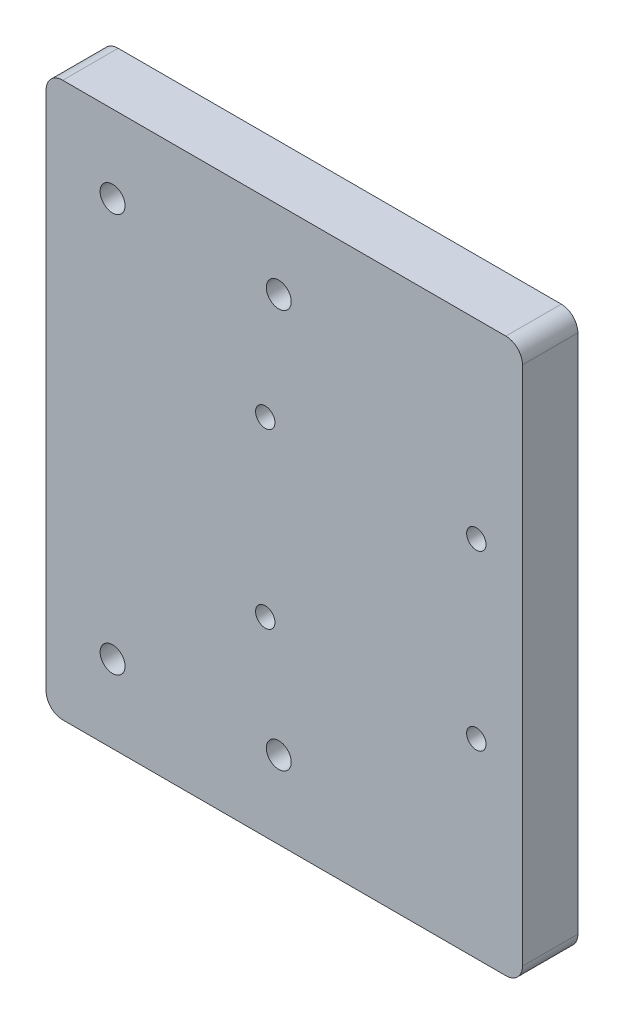
ISO-10303-21;
HEADER;
FILE_DESCRIPTION(('STEP AP214'),'2;1');
FILE_NAME('part.step','',(''),(''),'','','');
FILE_SCHEMA(('AUTOMOTIVE_DESIGN { 1 0 10303 214 1 1 1 1 }'));
ENDSEC;
DATA;
#1=APPLICATION_CONTEXT('core data for automotive mechanical design processes');
#2=APPLICATION_PROTOCOL_DEFINITION('international standard','automotive_design',2000,#1);
#3=PRODUCT_CONTEXT('',#1,'mechanical');
#4=PRODUCT('Part','Part','',(#3));
#5=PRODUCT_RELATED_PRODUCT_CATEGORY('part','',(#4));
#6=PRODUCT_DEFINITION_FORMATION('','',#4);
#7=PRODUCT_DEFINITION_CONTEXT('part definition',#1,'design');
#8=PRODUCT_DEFINITION('design','',#6,#7);
#9=PRODUCT_DEFINITION_SHAPE('','',#8);
#10=(LENGTH_UNIT() NAMED_UNIT(*) SI_UNIT(.MILLI.,.METRE.));
#11=(NAMED_UNIT(*) PLANE_ANGLE_UNIT() SI_UNIT($,.RADIAN.));
#12=(NAMED_UNIT(*) SI_UNIT($,.STERADIAN.) SOLID_ANGLE_UNIT());
#13=UNCERTAINTY_MEASURE_WITH_UNIT(LENGTH_MEASURE(1.E-05),#10,'distance_accuracy_value','');
#14=(GEOMETRIC_REPRESENTATION_CONTEXT(3) GLOBAL_UNCERTAINTY_ASSIGNED_CONTEXT((#13)) GLOBAL_UNIT_ASSIGNED_CONTEXT((#10,
#11,#12)) REPRESENTATION_CONTEXT('',''));
#15=CARTESIAN_POINT('',(0.,0.,0.));
#16=DIRECTION('',(0.,0.,1.));
#17=DIRECTION('',(1.,0.,0.));
#18=AXIS2_PLACEMENT_3D('',#15,#16,#17);
#19=CARTESIAN_POINT('',(-40.,-47.,10.));
#20=DIRECTION('',(0.,0.,-1.));
#21=DIRECTION('',(-1.,0.,0.));
#22=AXIS2_PLACEMENT_3D('',#19,#20,#21);
#23=PLANE('',#22);
#24=CARTESIAN_POINT('',(-40.,-47.,10.));
#25=DIRECTION('',(0.,0.,1.));
#26=DIRECTION('',(-1.,0.,0.));
#27=AXIS2_PLACEMENT_3D('',#24,#25,#26);
#28=CIRCLE('',#27,2.99999999999691);
#29=CARTESIAN_POINT('',(-42.9999999999969,-47.,10.));
#30=VERTEX_POINT('',#29);
#31=CARTESIAN_POINT('',(-40.,-49.9999999999969,10.));
#32=VERTEX_POINT('',#31);
#33=EDGE_CURVE('E155',#30,#32,#28,.T.);
#34=ORIENTED_EDGE('',*,*,#33,.T.);
#35=DIRECTION('',(1.,0.,0.));
#36=VECTOR('',#35,1.);
#37=CARTESIAN_POINT('',(39.9999999850309,-49.9999999999969,10.));
#38=LINE('',#37,#36);
#39=CARTESIAN_POINT('',(39.9999999850309,-49.9999999999969,10.));
#40=VERTEX_POINT('',#39);
#41=EDGE_CURVE('E103',#32,#40,#38,.T.);
#42=ORIENTED_EDGE('',*,*,#41,.T.);
#43=CARTESIAN_POINT('',(39.9999999850309,-46.9999999999969,10.));
#44=DIRECTION('',(0.,0.,1.));
#45=DIRECTION('',(-1.,0.,0.));
#46=AXIS2_PLACEMENT_3D('',#43,#44,#45);
#47=CIRCLE('',#46,3.00000000000002);
#48=CARTESIAN_POINT('',(42.9999999850309,-46.9999999999969,10.));
#49=VERTEX_POINT('',#48);
#50=EDGE_CURVE('E170',#40,#49,#47,.T.);
#51=ORIENTED_EDGE('',*,*,#50,.T.);
#52=DIRECTION('',(0.,1.,0.));
#53=VECTOR('',#52,1.);
#54=CARTESIAN_POINT('',(42.9999999850309,47.0000000000031,10.));
#55=LINE('',#54,#53);
#56=CARTESIAN_POINT('',(42.9999999850309,47.0000000000031,10.));
#57=VERTEX_POINT('',#56);
#58=EDGE_CURVE('E183',#49,#57,#55,.T.);
#59=ORIENTED_EDGE('',*,*,#58,.T.);
#60=CARTESIAN_POINT('',(39.9999999850309,46.9999999999969,10.));
#61=DIRECTION('',(0.,0.,1.));
#62=DIRECTION('',(-1.,0.,0.));
#63=AXIS2_PLACEMENT_3D('',#60,#61,#62);
#64=CIRCLE('',#63,3.);
#65=CARTESIAN_POINT('',(39.9999999850309,49.9999999999969,10.));
#66=VERTEX_POINT('',#65);
#67=EDGE_CURVE('E122',#57,#66,#64,.T.);
#68=ORIENTED_EDGE('',*,*,#67,.T.);
#69=DIRECTION('',(-1.,0.,0.));
#70=VECTOR('',#69,1.);
#71=CARTESIAN_POINT('',(-40.,49.9999999999969,10.));
#72=LINE('',#71,#70);
#73=CARTESIAN_POINT('',(-40.,49.9999999999969,10.));
#74=VERTEX_POINT('',#73);
#75=EDGE_CURVE('E116',#66,#74,#72,.T.);
#76=ORIENTED_EDGE('',*,*,#75,.T.);
#77=CARTESIAN_POINT('',(-40.,47.,10.));
#78=DIRECTION('',(0.,0.,1.));
#79=DIRECTION('',(-1.,0.,0.));
#80=AXIS2_PLACEMENT_3D('',#77,#78,#79);
#81=CIRCLE('',#80,2.99999999999691);
#82=CARTESIAN_POINT('',(-42.9999999999969,47.,10.));
#83=VERTEX_POINT('',#82);
#84=EDGE_CURVE('E120',#74,#83,#81,.T.);
#85=ORIENTED_EDGE('',*,*,#84,.T.);
#86=DIRECTION('',(0.,-1.,0.));
#87=VECTOR('',#86,1.);
#88=CARTESIAN_POINT('',(-42.9999999999969,-47.,10.));
#89=LINE('',#88,#87);
#90=EDGE_CURVE('E60',#83,#30,#89,.T.);
#91=ORIENTED_EDGE('',*,*,#90,.T.);
#92=EDGE_LOOP('',(#34,#42,#51,#59,#68,#76,#85,#91));
#93=FACE_BOUND('',#92,.T.);
#94=CARTESIAN_POINT('',(-31.,-36.,10.));
#95=DIRECTION('',(0.,0.,1.));
#96=DIRECTION('',(1.,0.,0.));
#97=AXIS2_PLACEMENT_3D('',#94,#95,#96);
#98=CIRCLE('',#97,2.25);
#99=CARTESIAN_POINT('',(-28.75,-36.,10.));
#100=VERTEX_POINT('',#99);
#101=EDGE_CURVE('E144',#100,#100,#98,.T.);
#102=ORIENTED_EDGE('',*,*,#101,.F.);
#103=EDGE_LOOP('',(#102));
#104=FACE_BOUND('',#103,.T.);
#105=CARTESIAN_POINT('',(-1.,-36.,10.));
#106=DIRECTION('',(0.,0.,1.));
#107=DIRECTION('',(1.,0.,0.));
#108=AXIS2_PLACEMENT_3D('',#105,#106,#107);
#109=CIRCLE('',#108,2.25);
#110=CARTESIAN_POINT('',(1.25,-36.,10.));
#111=VERTEX_POINT('',#110);
#112=EDGE_CURVE('E192',#111,#111,#109,.T.);
#113=ORIENTED_EDGE('',*,*,#112,.F.);
#114=EDGE_LOOP('',(#113));
#115=FACE_BOUND('',#114,.T.);
#116=CARTESIAN_POINT('',(-3.4375,-15.621,10.));
#117=DIRECTION('',(0.,0.,1.));
#118=DIRECTION('',(1.,0.,0.));
#119=AXIS2_PLACEMENT_3D('',#116,#117,#118);
#120=CIRCLE('',#119,1.75);
#121=CARTESIAN_POINT('',(-1.6875,-15.621,10.));
#122=VERTEX_POINT('',#121);
#123=EDGE_CURVE('E198',#122,#122,#120,.T.);
#124=ORIENTED_EDGE('',*,*,#123,.F.);
#125=EDGE_LOOP('',(#124));
#126=FACE_BOUND('',#125,.T.);
#127=CARTESIAN_POINT('',(34.6625,-15.621,10.));
#128=DIRECTION('',(0.,0.,1.));
#129=DIRECTION('',(1.,0.,0.));
#130=AXIS2_PLACEMENT_3D('',#127,#128,#129);
#131=CIRCLE('',#130,1.75);
#132=CARTESIAN_POINT('',(36.4125,-15.621,10.));
#133=VERTEX_POINT('',#132);
#134=EDGE_CURVE('E204',#133,#133,#131,.T.);
#135=ORIENTED_EDGE('',*,*,#134,.F.);
#136=EDGE_LOOP('',(#135));
#137=FACE_BOUND('',#136,.T.);
#138=CARTESIAN_POINT('',(-3.4375,15.621,10.));
#139=DIRECTION('',(0.,0.,1.));
#140=DIRECTION('',(1.,0.,0.));
#141=AXIS2_PLACEMENT_3D('',#138,#139,#140);
#142=CIRCLE('',#141,1.75);
#143=CARTESIAN_POINT('',(-1.6875,15.621,10.));
#144=VERTEX_POINT('',#143);
#145=EDGE_CURVE('E210',#144,#144,#142,.T.);
#146=ORIENTED_EDGE('',*,*,#145,.F.);
#147=EDGE_LOOP('',(#146));
#148=FACE_BOUND('',#147,.T.);
#149=CARTESIAN_POINT('',(-31.,36.,10.));
#150=DIRECTION('',(0.,0.,1.));
#151=DIRECTION('',(1.,0.,0.));
#152=AXIS2_PLACEMENT_3D('',#149,#150,#151);
#153=CIRCLE('',#152,2.25);
#154=CARTESIAN_POINT('',(-28.75,36.,10.));
#155=VERTEX_POINT('',#154);
#156=EDGE_CURVE('E216',#155,#155,#153,.T.);
#157=ORIENTED_EDGE('',*,*,#156,.F.);
#158=EDGE_LOOP('',(#157));
#159=FACE_BOUND('',#158,.T.);
#160=CARTESIAN_POINT('',(-1.,36.,10.));
#161=DIRECTION('',(0.,0.,1.));
#162=DIRECTION('',(1.,0.,0.));
#163=AXIS2_PLACEMENT_3D('',#160,#161,#162);
#164=CIRCLE('',#163,2.25);
#165=CARTESIAN_POINT('',(1.25,36.,10.));
#166=VERTEX_POINT('',#165);
#167=EDGE_CURVE('E222',#166,#166,#164,.T.);
#168=ORIENTED_EDGE('',*,*,#167,.F.);
#169=EDGE_LOOP('',(#168));
#170=FACE_BOUND('',#169,.T.);
#171=CARTESIAN_POINT('',(34.6625,15.621,10.));
#172=DIRECTION('',(0.,0.,1.));
#173=DIRECTION('',(1.,0.,0.));
#174=AXIS2_PLACEMENT_3D('',#171,#172,#173);
#175=CIRCLE('',#174,1.75);
#176=CARTESIAN_POINT('',(36.4125,15.621,10.));
#177=VERTEX_POINT('',#176);
#178=EDGE_CURVE('E228',#177,#177,#175,.T.);
#179=ORIENTED_EDGE('',*,*,#178,.F.);
#180=EDGE_LOOP('',(#179));
#181=FACE_BOUND('',#180,.T.);
#182=ADVANCED_FACE('F43',(#93,#104,#115,#126,#137,#148,#159,#170,#181),#23,.F.);
#183=CARTESIAN_POINT('',(-40.,-47.,0.));
#184=DIRECTION('',(0.,0.,-1.));
#185=DIRECTION('',(-1.,0.,0.));
#186=AXIS2_PLACEMENT_3D('',#183,#184,#185);
#187=PLANE('',#186);
#188=CARTESIAN_POINT('',(-1.,36.,0.));
#189=DIRECTION('',(0.,0.,1.));
#190=DIRECTION('',(1.,0.,0.));
#191=AXIS2_PLACEMENT_3D('',#188,#189,#190);
#192=CIRCLE('',#191,2.25);
#193=CARTESIAN_POINT('',(1.25,36.,0.));
#194=VERTEX_POINT('',#193);
#195=EDGE_CURVE('E225',#194,#194,#192,.T.);
#196=ORIENTED_EDGE('',*,*,#195,.T.);
#197=EDGE_LOOP('',(#196));
#198=FACE_BOUND('',#197,.T.);
#199=CARTESIAN_POINT('',(-3.4375,15.621,0.));
#200=DIRECTION('',(0.,0.,1.));
#201=DIRECTION('',(1.,0.,0.));
#202=AXIS2_PLACEMENT_3D('',#199,#200,#201);
#203=CIRCLE('',#202,1.75);
#204=CARTESIAN_POINT('',(-1.6875,15.621,0.));
#205=VERTEX_POINT('',#204);
#206=EDGE_CURVE('E213',#205,#205,#203,.T.);
#207=ORIENTED_EDGE('',*,*,#206,.T.);
#208=EDGE_LOOP('',(#207));
#209=FACE_BOUND('',#208,.T.);
#210=CARTESIAN_POINT('',(-3.4375,-15.621,0.));
#211=DIRECTION('',(0.,0.,1.));
#212=DIRECTION('',(1.,0.,0.));
#213=AXIS2_PLACEMENT_3D('',#210,#211,#212);
#214=CIRCLE('',#213,1.75);
#215=CARTESIAN_POINT('',(-1.6875,-15.621,0.));
#216=VERTEX_POINT('',#215);
#217=EDGE_CURVE('E201',#216,#216,#214,.T.);
#218=ORIENTED_EDGE('',*,*,#217,.T.);
#219=EDGE_LOOP('',(#218));
#220=FACE_BOUND('',#219,.T.);
#221=CARTESIAN_POINT('',(-31.,-36.,0.));
#222=DIRECTION('',(0.,0.,1.));
#223=DIRECTION('',(1.,0.,0.));
#224=AXIS2_PLACEMENT_3D('',#221,#222,#223);
#225=CIRCLE('',#224,2.25);
#226=CARTESIAN_POINT('',(-28.75,-36.,0.));
#227=VERTEX_POINT('',#226);
#228=EDGE_CURVE('E189',#227,#227,#225,.T.);
#229=ORIENTED_EDGE('',*,*,#228,.T.);
#230=EDGE_LOOP('',(#229));
#231=FACE_BOUND('',#230,.T.);
#232=CARTESIAN_POINT('',(-40.,-47.,0.));
#233=DIRECTION('',(0.,0.,1.));
#234=DIRECTION('',(-1.,0.,0.));
#235=AXIS2_PLACEMENT_3D('',#232,#233,#234);
#236=CIRCLE('',#235,2.99999999999691);
#237=CARTESIAN_POINT('',(-42.9999999999969,-47.,0.));
#238=VERTEX_POINT('',#237);
#239=CARTESIAN_POINT('',(-40.,-49.9999999999969,0.));
#240=VERTEX_POINT('',#239);
#241=EDGE_CURVE('E140',#238,#240,#236,.T.);
#242=ORIENTED_EDGE('',*,*,#241,.F.);
#243=DIRECTION('',(0.,-1.,0.));
#244=VECTOR('',#243,1.);
#245=CARTESIAN_POINT('',(-42.9999999999969,-47.,0.));
#246=LINE('',#245,#244);
#247=CARTESIAN_POINT('',(-42.9999999999969,47.,0.));
#248=VERTEX_POINT('',#247);
#249=EDGE_CURVE('E95',#248,#238,#246,.T.);
#250=ORIENTED_EDGE('',*,*,#249,.F.);
#251=CARTESIAN_POINT('',(-40.,47.,0.));
#252=DIRECTION('',(0.,0.,1.));
#253=DIRECTION('',(-1.,0.,0.));
#254=AXIS2_PLACEMENT_3D('',#251,#252,#253);
#255=CIRCLE('',#254,2.99999999999691);
#256=CARTESIAN_POINT('',(-40.,49.9999999999969,0.));
#257=VERTEX_POINT('',#256);
#258=EDGE_CURVE('E89',#257,#248,#255,.T.);
#259=ORIENTED_EDGE('',*,*,#258,.F.);
#260=DIRECTION('',(-1.,0.,0.));
#261=VECTOR('',#260,1.);
#262=CARTESIAN_POINT('',(-40.,49.9999999999969,0.));
#263=LINE('',#262,#261);
#264=CARTESIAN_POINT('',(39.9999999850309,49.9999999999969,0.));
#265=VERTEX_POINT('',#264);
#266=EDGE_CURVE('E130',#265,#257,#263,.T.);
#267=ORIENTED_EDGE('',*,*,#266,.F.);
#268=CARTESIAN_POINT('',(39.9999999850309,46.9999999999969,0.));
#269=DIRECTION('',(0.,0.,1.));
#270=DIRECTION('',(-1.,0.,0.));
#271=AXIS2_PLACEMENT_3D('',#268,#269,#270);
#272=CIRCLE('',#271,3.);
#273=CARTESIAN_POINT('',(42.9999999850309,47.0000000000031,0.));
#274=VERTEX_POINT('',#273);
#275=EDGE_CURVE('E150',#274,#265,#272,.T.);
#276=ORIENTED_EDGE('',*,*,#275,.F.);
#277=DIRECTION('',(0.,1.,0.));
#278=VECTOR('',#277,1.);
#279=CARTESIAN_POINT('',(42.9999999850309,47.0000000000031,0.));
#280=LINE('',#279,#278);
#281=CARTESIAN_POINT('',(42.9999999850309,-46.9999999999969,0.));
#282=VERTEX_POINT('',#281);
#283=EDGE_CURVE('E148',#282,#274,#280,.T.);
#284=ORIENTED_EDGE('',*,*,#283,.F.);
#285=CARTESIAN_POINT('',(39.9999999850309,-46.9999999999969,0.));
#286=DIRECTION('',(0.,0.,1.));
#287=DIRECTION('',(-1.,0.,0.));
#288=AXIS2_PLACEMENT_3D('',#285,#286,#287);
#289=CIRCLE('',#288,3.00000000000002);
#290=CARTESIAN_POINT('',(39.9999999850309,-49.9999999999969,0.));
#291=VERTEX_POINT('',#290);
#292=EDGE_CURVE('E146',#291,#282,#289,.T.);
#293=ORIENTED_EDGE('',*,*,#292,.F.);
#294=DIRECTION('',(1.,0.,0.));
#295=VECTOR('',#294,1.);
#296=CARTESIAN_POINT('',(39.9999999850309,-49.9999999999969,0.));
#297=LINE('',#296,#295);
#298=EDGE_CURVE('E143',#240,#291,#297,.T.);
#299=ORIENTED_EDGE('',*,*,#298,.F.);
#300=EDGE_LOOP('',(#242,#250,#259,#267,#276,#284,#293,#299));
#301=FACE_BOUND('',#300,.T.);
#302=CARTESIAN_POINT('',(-1.,-36.,0.));
#303=DIRECTION('',(0.,0.,1.));
#304=DIRECTION('',(1.,0.,0.));
#305=AXIS2_PLACEMENT_3D('',#302,#303,#304);
#306=CIRCLE('',#305,2.25);
#307=CARTESIAN_POINT('',(1.25,-36.,0.));
#308=VERTEX_POINT('',#307);
#309=EDGE_CURVE('E195',#308,#308,#306,.T.);
#310=ORIENTED_EDGE('',*,*,#309,.T.);
#311=EDGE_LOOP('',(#310));
#312=FACE_BOUND('',#311,.T.);
#313=CARTESIAN_POINT('',(34.6625,-15.621,0.));
#314=DIRECTION('',(0.,0.,1.));
#315=DIRECTION('',(1.,0.,0.));
#316=AXIS2_PLACEMENT_3D('',#313,#314,#315);
#317=CIRCLE('',#316,1.75);
#318=CARTESIAN_POINT('',(36.4125,-15.621,0.));
#319=VERTEX_POINT('',#318);
#320=EDGE_CURVE('E207',#319,#319,#317,.T.);
#321=ORIENTED_EDGE('',*,*,#320,.T.);
#322=EDGE_LOOP('',(#321));
#323=FACE_BOUND('',#322,.T.);
#324=CARTESIAN_POINT('',(-31.,36.,0.));
#325=DIRECTION('',(0.,0.,1.));
#326=DIRECTION('',(1.,0.,0.));
#327=AXIS2_PLACEMENT_3D('',#324,#325,#326);
#328=CIRCLE('',#327,2.25);
#329=CARTESIAN_POINT('',(-28.75,36.,0.));
#330=VERTEX_POINT('',#329);
#331=EDGE_CURVE('E219',#330,#330,#328,.T.);
#332=ORIENTED_EDGE('',*,*,#331,.T.);
#333=EDGE_LOOP('',(#332));
#334=FACE_BOUND('',#333,.T.);
#335=CARTESIAN_POINT('',(34.6625,15.621,0.));
#336=DIRECTION('',(0.,0.,1.));
#337=DIRECTION('',(1.,0.,0.));
#338=AXIS2_PLACEMENT_3D('',#335,#336,#337);
#339=CIRCLE('',#338,1.75);
#340=CARTESIAN_POINT('',(36.4125,15.621,0.));
#341=VERTEX_POINT('',#340);
#342=EDGE_CURVE('E231',#341,#341,#339,.T.);
#343=ORIENTED_EDGE('',*,*,#342,.T.);
#344=EDGE_LOOP('',(#343));
#345=FACE_BOUND('',#344,.T.);
#346=ADVANCED_FACE('F174',(#198,#209,#220,#231,#301,#312,#323,#334,#345),#187,.T.);
#347=CARTESIAN_POINT('',(-40.,-47.,10.));
#348=DIRECTION('',(0.,0.,-1.));
#349=DIRECTION('',(-1.,0.,0.));
#350=AXIS2_PLACEMENT_3D('',#347,#348,#349);
#351=CYLINDRICAL_SURFACE('',#350,2.99999999999691);
#352=ORIENTED_EDGE('',*,*,#241,.T.);
#353=DIRECTION('',(0.,0.,-1.));
#354=VECTOR('',#353,1.);
#355=CARTESIAN_POINT('',(-40.,-49.9999999999969,10.));
#356=LINE('',#355,#354);
#357=EDGE_CURVE('E11',#32,#240,#356,.T.);
#358=ORIENTED_EDGE('',*,*,#357,.F.);
#359=ORIENTED_EDGE('',*,*,#33,.F.);
#360=DIRECTION('',(0.,0.,-1.));
#361=VECTOR('',#360,1.);
#362=CARTESIAN_POINT('',(-42.9999999999969,-47.,10.));
#363=LINE('',#362,#361);
#364=EDGE_CURVE('E136',#30,#238,#363,.T.);
#365=ORIENTED_EDGE('',*,*,#364,.T.);
#366=EDGE_LOOP('',(#352,#358,#359,#365));
#367=FACE_BOUND('',#366,.T.);
#368=ADVANCED_FACE('F45',(#367),#351,.T.);
#369=CARTESIAN_POINT('',(39.9999999850309,-49.9999999999969,10.));
#370=DIRECTION('',(0.,1.,0.));
#371=DIRECTION('',(0.,0.,1.));
#372=AXIS2_PLACEMENT_3D('',#369,#370,#371);
#373=PLANE('',#372);
#374=ORIENTED_EDGE('',*,*,#298,.T.);
#375=DIRECTION('',(0.,0.,-1.));
#376=VECTOR('',#375,1.);
#377=CARTESIAN_POINT('',(39.9999999850309,-49.9999999999969,10.));
#378=LINE('',#377,#376);
#379=EDGE_CURVE('E52',#40,#291,#378,.T.);
#380=ORIENTED_EDGE('',*,*,#379,.F.);
#381=ORIENTED_EDGE('',*,*,#41,.F.);
#382=ORIENTED_EDGE('',*,*,#357,.T.);
#383=EDGE_LOOP('',(#374,#380,#381,#382));
#384=FACE_BOUND('',#383,.T.);
#385=ADVANCED_FACE('F263',(#384),#373,.F.);
#386=CARTESIAN_POINT('',(39.9999999850309,-46.9999999999969,10.));
#387=DIRECTION('',(0.,0.,-1.));
#388=DIRECTION('',(-1.,0.,0.));
#389=AXIS2_PLACEMENT_3D('',#386,#387,#388);
#390=CYLINDRICAL_SURFACE('',#389,3.00000000000002);
#391=ORIENTED_EDGE('',*,*,#292,.T.);
#392=DIRECTION('',(0.,0.,-1.));
#393=VECTOR('',#392,1.);
#394=CARTESIAN_POINT('',(42.9999999850309,-46.9999999999969,10.));
#395=LINE('',#394,#393);
#396=EDGE_CURVE('E162',#49,#282,#395,.T.);
#397=ORIENTED_EDGE('',*,*,#396,.F.);
#398=ORIENTED_EDGE('',*,*,#50,.F.);
#399=ORIENTED_EDGE('',*,*,#379,.T.);
#400=EDGE_LOOP('',(#391,#397,#398,#399));
#401=FACE_BOUND('',#400,.T.);
#402=ADVANCED_FACE('F168',(#401),#390,.T.);
#403=CARTESIAN_POINT('',(42.9999999850309,47.0000000000031,10.));
#404=DIRECTION('',(-1.,0.,0.));
#405=DIRECTION('',(0.,0.,1.));
#406=AXIS2_PLACEMENT_3D('',#403,#404,#405);
#407=PLANE('',#406);
#408=ORIENTED_EDGE('',*,*,#283,.T.);
#409=DIRECTION('',(0.,0.,-1.));
#410=VECTOR('',#409,1.);
#411=CARTESIAN_POINT('',(42.9999999850309,47.0000000000031,10.));
#412=LINE('',#411,#410);
#413=EDGE_CURVE('E159',#57,#274,#412,.T.);
#414=ORIENTED_EDGE('',*,*,#413,.F.);
#415=ORIENTED_EDGE('',*,*,#58,.F.);
#416=ORIENTED_EDGE('',*,*,#396,.T.);
#417=EDGE_LOOP('',(#408,#414,#415,#416));
#418=FACE_BOUND('',#417,.T.);
#419=ADVANCED_FACE('F179',(#418),#407,.F.);
#420=CARTESIAN_POINT('',(39.9999999850309,46.9999999999969,10.));
#421=DIRECTION('',(0.,0.,-1.));
#422=DIRECTION('',(-1.,0.,0.));
#423=AXIS2_PLACEMENT_3D('',#420,#421,#422);
#424=CYLINDRICAL_SURFACE('',#423,3.);
#425=ORIENTED_EDGE('',*,*,#275,.T.);
#426=DIRECTION('',(0.,0.,-1.));
#427=VECTOR('',#426,1.);
#428=CARTESIAN_POINT('',(39.9999999850309,49.9999999999969,10.));
#429=LINE('',#428,#427);
#430=EDGE_CURVE('E131',#66,#265,#429,.T.);
#431=ORIENTED_EDGE('',*,*,#430,.F.);
#432=ORIENTED_EDGE('',*,*,#67,.F.);
#433=ORIENTED_EDGE('',*,*,#413,.T.);
#434=EDGE_LOOP('',(#425,#431,#432,#433));
#435=FACE_BOUND('',#434,.T.);
#436=ADVANCED_FACE('F182',(#435),#424,.T.);
#437=CARTESIAN_POINT('',(-40.,49.9999999999969,10.));
#438=DIRECTION('',(0.,-1.,0.));
#439=DIRECTION('',(0.,0.,-1.));
#440=AXIS2_PLACEMENT_3D('',#437,#438,#439);
#441=PLANE('',#440);
#442=ORIENTED_EDGE('',*,*,#266,.T.);
#443=DIRECTION('',(0.,0.,-1.));
#444=VECTOR('',#443,1.);
#445=CARTESIAN_POINT('',(-40.,49.9999999999969,10.));
#446=LINE('',#445,#444);
#447=EDGE_CURVE('E127',#74,#257,#446,.T.);
#448=ORIENTED_EDGE('',*,*,#447,.F.);
#449=ORIENTED_EDGE('',*,*,#75,.F.);
#450=ORIENTED_EDGE('',*,*,#430,.T.);
#451=EDGE_LOOP('',(#442,#448,#449,#450));
#452=FACE_BOUND('',#451,.T.);
#453=ADVANCED_FACE('F128',(#452),#441,.F.);
#454=CARTESIAN_POINT('',(-40.,47.,10.));
#455=DIRECTION('',(0.,0.,-1.));
#456=DIRECTION('',(-1.,0.,0.));
#457=AXIS2_PLACEMENT_3D('',#454,#455,#456);
#458=CYLINDRICAL_SURFACE('',#457,2.99999999999691);
#459=ORIENTED_EDGE('',*,*,#258,.T.);
#460=DIRECTION('',(0.,0.,-1.));
#461=VECTOR('',#460,1.);
#462=CARTESIAN_POINT('',(-42.9999999999969,47.,10.));
#463=LINE('',#462,#461);
#464=EDGE_CURVE('E132',#83,#248,#463,.T.);
#465=ORIENTED_EDGE('',*,*,#464,.F.);
#466=ORIENTED_EDGE('',*,*,#84,.F.);
#467=ORIENTED_EDGE('',*,*,#447,.T.);
#468=EDGE_LOOP('',(#459,#465,#466,#467));
#469=FACE_BOUND('',#468,.T.);
#470=ADVANCED_FACE('F134',(#469),#458,.T.);
#471=CARTESIAN_POINT('',(-42.9999999999969,-47.,10.));
#472=DIRECTION('',(1.,0.,0.));
#473=DIRECTION('',(0.,0.,-1.));
#474=AXIS2_PLACEMENT_3D('',#471,#472,#473);
#475=PLANE('',#474);
#476=ORIENTED_EDGE('',*,*,#249,.T.);
#477=ORIENTED_EDGE('',*,*,#364,.F.);
#478=ORIENTED_EDGE('',*,*,#90,.F.);
#479=ORIENTED_EDGE('',*,*,#464,.T.);
#480=EDGE_LOOP('',(#476,#477,#478,#479));
#481=FACE_BOUND('',#480,.T.);
#482=ADVANCED_FACE('F251',(#481),#475,.F.);
#483=CARTESIAN_POINT('',(-31.,-36.,10.));
#484=DIRECTION('',(0.,0.,-1.));
#485=DIRECTION('',(-1.,0.,0.));
#486=AXIS2_PLACEMENT_3D('',#483,#484,#485);
#487=CYLINDRICAL_SURFACE('',#486,2.25);
#488=ORIENTED_EDGE('',*,*,#101,.T.);
#489=EDGE_LOOP('',(#488));
#490=FACE_BOUND('',#489,.T.);
#491=ORIENTED_EDGE('',*,*,#228,.F.);
#492=EDGE_LOOP('',(#491));
#493=FACE_BOUND('',#492,.T.);
#494=ADVANCED_FACE('F248',(#490,#493),#487,.F.);
#495=CARTESIAN_POINT('',(-1.,-36.,10.));
#496=DIRECTION('',(0.,0.,-1.));
#497=DIRECTION('',(-1.,0.,0.));
#498=AXIS2_PLACEMENT_3D('',#495,#496,#497);
#499=CYLINDRICAL_SURFACE('',#498,2.25);
#500=ORIENTED_EDGE('',*,*,#112,.T.);
#501=EDGE_LOOP('',(#500));
#502=FACE_BOUND('',#501,.T.);
#503=ORIENTED_EDGE('',*,*,#309,.F.);
#504=EDGE_LOOP('',(#503));
#505=FACE_BOUND('',#504,.T.);
#506=ADVANCED_FACE('F326',(#502,#505),#499,.F.);
#507=CARTESIAN_POINT('',(-3.4375,-15.621,10.));
#508=DIRECTION('',(0.,0.,-1.));
#509=DIRECTION('',(-1.,0.,0.));
#510=AXIS2_PLACEMENT_3D('',#507,#508,#509);
#511=CYLINDRICAL_SURFACE('',#510,1.75);
#512=ORIENTED_EDGE('',*,*,#123,.T.);
#513=EDGE_LOOP('',(#512));
#514=FACE_BOUND('',#513,.T.);
#515=ORIENTED_EDGE('',*,*,#217,.F.);
#516=EDGE_LOOP('',(#515));
#517=FACE_BOUND('',#516,.T.);
#518=ADVANCED_FACE('F334',(#514,#517),#511,.F.);
#519=CARTESIAN_POINT('',(34.6625,-15.621,10.));
#520=DIRECTION('',(0.,0.,-1.));
#521=DIRECTION('',(-1.,0.,0.));
#522=AXIS2_PLACEMENT_3D('',#519,#520,#521);
#523=CYLINDRICAL_SURFACE('',#522,1.75);
#524=ORIENTED_EDGE('',*,*,#134,.T.);
#525=EDGE_LOOP('',(#524));
#526=FACE_BOUND('',#525,.T.);
#527=ORIENTED_EDGE('',*,*,#320,.F.);
#528=EDGE_LOOP('',(#527));
#529=FACE_BOUND('',#528,.T.);
#530=ADVANCED_FACE('F342',(#526,#529),#523,.F.);
#531=CARTESIAN_POINT('',(-3.4375,15.621,10.));
#532=DIRECTION('',(0.,0.,-1.));
#533=DIRECTION('',(-1.,0.,0.));
#534=AXIS2_PLACEMENT_3D('',#531,#532,#533);
#535=CYLINDRICAL_SURFACE('',#534,1.75);
#536=ORIENTED_EDGE('',*,*,#145,.T.);
#537=EDGE_LOOP('',(#536));
#538=FACE_BOUND('',#537,.T.);
#539=ORIENTED_EDGE('',*,*,#206,.F.);
#540=EDGE_LOOP('',(#539));
#541=FACE_BOUND('',#540,.T.);
#542=ADVANCED_FACE('F351',(#538,#541),#535,.F.);
#543=CARTESIAN_POINT('',(-31.,36.,10.));
#544=DIRECTION('',(0.,0.,-1.));
#545=DIRECTION('',(-1.,0.,0.));
#546=AXIS2_PLACEMENT_3D('',#543,#544,#545);
#547=CYLINDRICAL_SURFACE('',#546,2.25);
#548=ORIENTED_EDGE('',*,*,#156,.T.);
#549=EDGE_LOOP('',(#548));
#550=FACE_BOUND('',#549,.T.);
#551=ORIENTED_EDGE('',*,*,#331,.F.);
#552=EDGE_LOOP('',(#551));
#553=FACE_BOUND('',#552,.T.);
#554=ADVANCED_FACE('F360',(#550,#553),#547,.F.);
#555=CARTESIAN_POINT('',(-1.,36.,10.));
#556=DIRECTION('',(0.,0.,-1.));
#557=DIRECTION('',(-1.,0.,0.));
#558=AXIS2_PLACEMENT_3D('',#555,#556,#557);
#559=CYLINDRICAL_SURFACE('',#558,2.25);
#560=ORIENTED_EDGE('',*,*,#167,.T.);
#561=EDGE_LOOP('',(#560));
#562=FACE_BOUND('',#561,.T.);
#563=ORIENTED_EDGE('',*,*,#195,.F.);
#564=EDGE_LOOP('',(#563));
#565=FACE_BOUND('',#564,.T.);
#566=ADVANCED_FACE('F369',(#562,#565),#559,.F.);
#567=CARTESIAN_POINT('',(34.6625,15.621,10.));
#568=DIRECTION('',(0.,0.,-1.));
#569=DIRECTION('',(-1.,0.,0.));
#570=AXIS2_PLACEMENT_3D('',#567,#568,#569);
#571=CYLINDRICAL_SURFACE('',#570,1.75);
#572=ORIENTED_EDGE('',*,*,#178,.T.);
#573=EDGE_LOOP('',(#572));
#574=FACE_BOUND('',#573,.T.);
#575=ORIENTED_EDGE('',*,*,#342,.F.);
#576=EDGE_LOOP('',(#575));
#577=FACE_BOUND('',#576,.T.);
#578=ADVANCED_FACE('F237',(#574,#577),#571,.F.);
#579=CLOSED_SHELL('',(#182,#346,#368,#385,#402,#419,#436,#453,#470,#482,#494,#506,#518,#530,
#542,#554,#566,#578));
#580=MANIFOLD_SOLID_BREP('B2',#579);
#581=ADVANCED_BREP_SHAPE_REPRESENTATION('',(#18,#580),#14);
#582=SHAPE_DEFINITION_REPRESENTATION(#9,#581);
ENDSEC;
END-ISO-10303-21;
